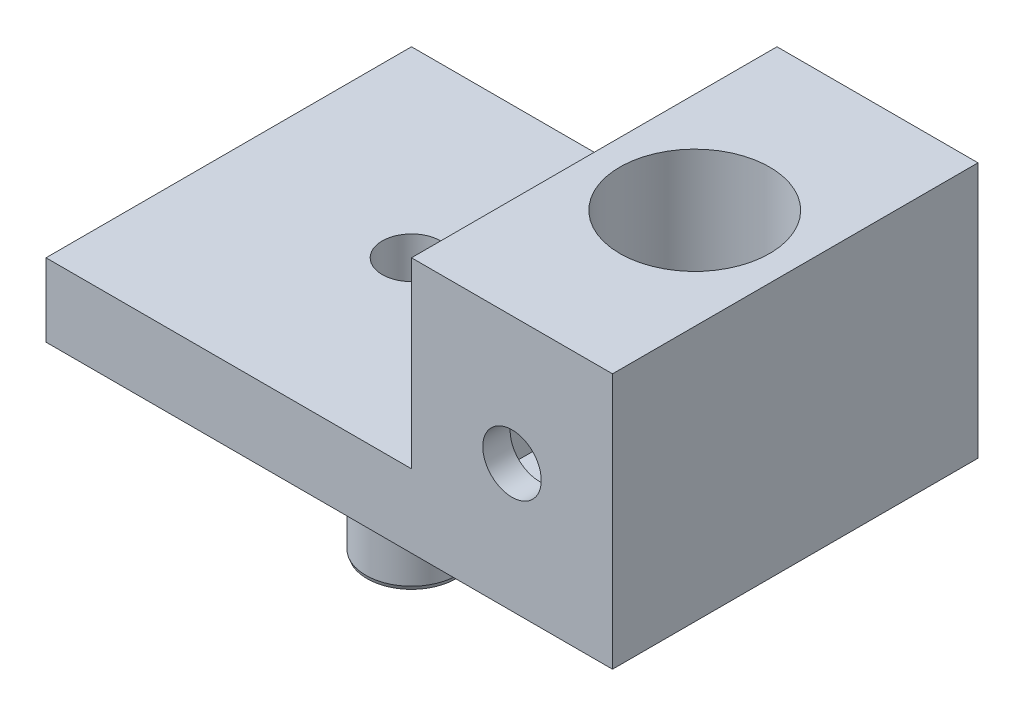
ISO-10303-21;
HEADER;
FILE_DESCRIPTION(('STEP AP214'),'2;1');
FILE_NAME('part.step','',(''),(''),'','','');
FILE_SCHEMA(('AUTOMOTIVE_DESIGN { 1 0 10303 214 1 1 1 1 }'));
ENDSEC;
DATA;
#1=APPLICATION_CONTEXT('core data for automotive mechanical design processes');
#2=APPLICATION_PROTOCOL_DEFINITION('international standard','automotive_design',2000,#1);
#3=PRODUCT_CONTEXT('',#1,'mechanical');
#4=PRODUCT('Part','Part','',(#3));
#5=PRODUCT_RELATED_PRODUCT_CATEGORY('part','',(#4));
#6=PRODUCT_DEFINITION_FORMATION('','',#4);
#7=PRODUCT_DEFINITION_CONTEXT('part definition',#1,'design');
#8=PRODUCT_DEFINITION('design','',#6,#7);
#9=PRODUCT_DEFINITION_SHAPE('','',#8);
#10=(LENGTH_UNIT() NAMED_UNIT(*) SI_UNIT(.MILLI.,.METRE.));
#11=(NAMED_UNIT(*) PLANE_ANGLE_UNIT() SI_UNIT($,.RADIAN.));
#12=(NAMED_UNIT(*) SI_UNIT($,.STERADIAN.) SOLID_ANGLE_UNIT());
#13=UNCERTAINTY_MEASURE_WITH_UNIT(LENGTH_MEASURE(1.E-05),#10,'distance_accuracy_value','');
#14=(GEOMETRIC_REPRESENTATION_CONTEXT(3) GLOBAL_UNCERTAINTY_ASSIGNED_CONTEXT((#13)) GLOBAL_UNIT_ASSIGNED_CONTEXT((#10,
#11,#12)) REPRESENTATION_CONTEXT('',''));
#15=CARTESIAN_POINT('',(0.,0.,0.));
#16=DIRECTION('',(0.,0.,1.));
#17=DIRECTION('',(1.,0.,0.));
#18=AXIS2_PLACEMENT_3D('',#15,#16,#17);
#19=CARTESIAN_POINT('',(0.,-4.,20.));
#20=DIRECTION('',(1.,0.,0.));
#21=DIRECTION('',(0.,0.,-1.));
#22=AXIS2_PLACEMENT_3D('',#19,#20,#21);
#23=PLANE('',#22);
#24=DIRECTION('',(0.,-1.,0.));
#25=VECTOR('',#24,1.);
#26=CARTESIAN_POINT('',(0.,-4.,0.));
#27=LINE('',#26,#25);
#28=CARTESIAN_POINT('',(0.,0.,0.));
#29=VERTEX_POINT('',#28);
#30=CARTESIAN_POINT('',(0.,-4.,0.));
#31=VERTEX_POINT('',#30);
#32=EDGE_CURVE('E128',#29,#31,#27,.T.);
#33=ORIENTED_EDGE('',*,*,#32,.T.);
#34=DIRECTION('',(0.,0.,-1.));
#35=VECTOR('',#34,1.);
#36=CARTESIAN_POINT('',(0.,-4.,20.));
#37=LINE('',#36,#35);
#38=CARTESIAN_POINT('',(0.,-4.,20.));
#39=VERTEX_POINT('',#38);
#40=EDGE_CURVE('E146',#39,#31,#37,.T.);
#41=ORIENTED_EDGE('',*,*,#40,.F.);
#42=DIRECTION('',(0.,-1.,0.));
#43=VECTOR('',#42,1.);
#44=CARTESIAN_POINT('',(0.,-4.,20.));
#45=LINE('',#44,#43);
#46=CARTESIAN_POINT('',(0.,0.,20.));
#47=VERTEX_POINT('',#46);
#48=EDGE_CURVE('E139',#47,#39,#45,.T.);
#49=ORIENTED_EDGE('',*,*,#48,.F.);
#50=DIRECTION('',(0.,0.,-1.));
#51=VECTOR('',#50,1.);
#52=CARTESIAN_POINT('',(0.,0.,20.));
#53=LINE('',#52,#51);
#54=EDGE_CURVE('E124',#47,#29,#53,.T.);
#55=ORIENTED_EDGE('',*,*,#54,.T.);
#56=EDGE_LOOP('',(#33,#41,#49,#55));
#57=FACE_BOUND('',#56,.T.);
#58=ADVANCED_FACE('F37',(#57),#23,.F.);
#59=CARTESIAN_POINT('',(31.,-4.,20.));
#60=DIRECTION('',(0.,1.,0.));
#61=DIRECTION('',(-1.,0.,0.));
#62=AXIS2_PLACEMENT_3D('',#59,#60,#61);
#63=PLANE('',#62);
#64=CARTESIAN_POINT('',(10.,-4.,10.));
#65=DIRECTION('',(0.,1.,0.));
#66=DIRECTION('',(-1.,0.,0.));
#67=AXIS2_PLACEMENT_3D('',#64,#65,#66);
#68=CIRCLE('',#67,2.8);
#69=CARTESIAN_POINT('',(7.2,-4.,10.));
#70=VERTEX_POINT('',#69);
#71=EDGE_CURVE('E148',#70,#70,#68,.F.);
#72=ORIENTED_EDGE('',*,*,#71,.F.);
#73=EDGE_LOOP('',(#72));
#74=FACE_BOUND('',#73,.T.);
#75=CARTESIAN_POINT('',(25.5,-4.,10.));
#76=DIRECTION('',(0.,1.,0.));
#77=DIRECTION('',(0.,0.,1.));
#78=AXIS2_PLACEMENT_3D('',#75,#76,#77);
#79=CIRCLE('',#78,4.10000000000001);
#80=CARTESIAN_POINT('',(25.5,-4.,14.1));
#81=VERTEX_POINT('',#80);
#82=EDGE_CURVE('E132',#81,#81,#79,.T.);
#83=ORIENTED_EDGE('',*,*,#82,.T.);
#84=EDGE_LOOP('',(#83));
#85=FACE_BOUND('',#84,.T.);
#86=DIRECTION('',(1.,0.,0.));
#87=VECTOR('',#86,1.);
#88=CARTESIAN_POINT('',(31.,-4.,0.));
#89=LINE('',#88,#87);
#90=CARTESIAN_POINT('',(31.,-4.,0.));
#91=VERTEX_POINT('',#90);
#92=EDGE_CURVE('E131',#31,#91,#89,.T.);
#93=ORIENTED_EDGE('',*,*,#92,.T.);
#94=DIRECTION('',(0.,0.,-1.));
#95=VECTOR('',#94,1.);
#96=CARTESIAN_POINT('',(31.,-4.,20.));
#97=LINE('',#96,#95);
#98=CARTESIAN_POINT('',(31.,-4.,20.));
#99=VERTEX_POINT('',#98);
#100=EDGE_CURVE('E143',#99,#91,#97,.T.);
#101=ORIENTED_EDGE('',*,*,#100,.F.);
#102=DIRECTION('',(1.,0.,0.));
#103=VECTOR('',#102,1.);
#104=CARTESIAN_POINT('',(31.,-4.,20.));
#105=LINE('',#104,#103);
#106=EDGE_CURVE('E94',#39,#99,#105,.T.);
#107=ORIENTED_EDGE('',*,*,#106,.F.);
#108=ORIENTED_EDGE('',*,*,#40,.T.);
#109=EDGE_LOOP('',(#93,#101,#107,#108));
#110=FACE_BOUND('',#109,.T.);
#111=ADVANCED_FACE('F201',(#74,#85,#110),#63,.F.);
#112=CARTESIAN_POINT('',(31.,10.,20.));
#113=DIRECTION('',(-1.,0.,0.));
#114=DIRECTION('',(0.,0.,1.));
#115=AXIS2_PLACEMENT_3D('',#112,#113,#114);
#116=PLANE('',#115);
#117=DIRECTION('',(0.,1.,0.));
#118=VECTOR('',#117,1.);
#119=CARTESIAN_POINT('',(31.,10.,0.));
#120=LINE('',#119,#118);
#121=CARTESIAN_POINT('',(31.,10.,0.));
#122=VERTEX_POINT('',#121);
#123=EDGE_CURVE('E134',#91,#122,#120,.T.);
#124=ORIENTED_EDGE('',*,*,#123,.T.);
#125=DIRECTION('',(0.,0.,-1.));
#126=VECTOR('',#125,1.);
#127=CARTESIAN_POINT('',(31.,10.,20.));
#128=LINE('',#127,#126);
#129=CARTESIAN_POINT('',(31.,10.,20.));
#130=VERTEX_POINT('',#129);
#131=EDGE_CURVE('E119',#130,#122,#128,.T.);
#132=ORIENTED_EDGE('',*,*,#131,.F.);
#133=DIRECTION('',(0.,1.,0.));
#134=VECTOR('',#133,1.);
#135=CARTESIAN_POINT('',(31.,10.,20.));
#136=LINE('',#135,#134);
#137=EDGE_CURVE('E110',#99,#130,#136,.T.);
#138=ORIENTED_EDGE('',*,*,#137,.F.);
#139=ORIENTED_EDGE('',*,*,#100,.T.);
#140=EDGE_LOOP('',(#124,#132,#138,#139));
#141=FACE_BOUND('',#140,.T.);
#142=ADVANCED_FACE('F206',(#141),#116,.F.);
#143=CARTESIAN_POINT('',(20.,10.,20.));
#144=DIRECTION('',(0.,-1.,0.));
#145=DIRECTION('',(0.,0.,-1.));
#146=AXIS2_PLACEMENT_3D('',#143,#144,#145);
#147=PLANE('',#146);
#148=CARTESIAN_POINT('',(25.5,10.,10.));
#149=DIRECTION('',(0.,1.,0.));
#150=DIRECTION('',(0.,0.,1.));
#151=AXIS2_PLACEMENT_3D('',#148,#149,#150);
#152=CIRCLE('',#151,4.10000000000001);
#153=CARTESIAN_POINT('',(25.5,10.,14.1));
#154=VERTEX_POINT('',#153);
#155=EDGE_CURVE('E279',#154,#154,#152,.T.);
#156=ORIENTED_EDGE('',*,*,#155,.F.);
#157=EDGE_LOOP('',(#156));
#158=FACE_BOUND('',#157,.T.);
#159=DIRECTION('',(-1.,0.,0.));
#160=VECTOR('',#159,1.);
#161=CARTESIAN_POINT('',(20.,10.,0.));
#162=LINE('',#161,#160);
#163=CARTESIAN_POINT('',(20.,10.,0.));
#164=VERTEX_POINT('',#163);
#165=EDGE_CURVE('E118',#122,#164,#162,.T.);
#166=ORIENTED_EDGE('',*,*,#165,.T.);
#167=DIRECTION('',(0.,0.,-1.));
#168=VECTOR('',#167,1.);
#169=CARTESIAN_POINT('',(20.,10.,20.));
#170=LINE('',#169,#168);
#171=CARTESIAN_POINT('',(20.,10.,20.));
#172=VERTEX_POINT('',#171);
#173=EDGE_CURVE('E115',#172,#164,#170,.T.);
#174=ORIENTED_EDGE('',*,*,#173,.F.);
#175=DIRECTION('',(-1.,0.,0.));
#176=VECTOR('',#175,1.);
#177=CARTESIAN_POINT('',(20.,10.,20.));
#178=LINE('',#177,#176);
#179=EDGE_CURVE('E104',#130,#172,#178,.T.);
#180=ORIENTED_EDGE('',*,*,#179,.F.);
#181=ORIENTED_EDGE('',*,*,#131,.T.);
#182=EDGE_LOOP('',(#166,#174,#180,#181));
#183=FACE_BOUND('',#182,.T.);
#184=ADVANCED_FACE('F116',(#158,#183),#147,.F.);
#185=CARTESIAN_POINT('',(20.,0.,20.));
#186=DIRECTION('',(1.,0.,0.));
#187=DIRECTION('',(0.,0.,-1.));
#188=AXIS2_PLACEMENT_3D('',#185,#186,#187);
#189=PLANE('',#188);
#190=DIRECTION('',(0.,-1.,0.));
#191=VECTOR('',#190,1.);
#192=CARTESIAN_POINT('',(20.,0.,0.));
#193=LINE('',#192,#191);
#194=CARTESIAN_POINT('',(20.,0.,0.));
#195=VERTEX_POINT('',#194);
#196=EDGE_CURVE('E79',#164,#195,#193,.T.);
#197=ORIENTED_EDGE('',*,*,#196,.T.);
#198=DIRECTION('',(0.,0.,-1.));
#199=VECTOR('',#198,1.);
#200=CARTESIAN_POINT('',(20.,0.,20.));
#201=LINE('',#200,#199);
#202=CARTESIAN_POINT('',(20.,0.,20.));
#203=VERTEX_POINT('',#202);
#204=EDGE_CURVE('E120',#203,#195,#201,.T.);
#205=ORIENTED_EDGE('',*,*,#204,.F.);
#206=DIRECTION('',(0.,-1.,0.));
#207=VECTOR('',#206,1.);
#208=CARTESIAN_POINT('',(20.,0.,20.));
#209=LINE('',#208,#207);
#210=EDGE_CURVE('E108',#172,#203,#209,.T.);
#211=ORIENTED_EDGE('',*,*,#210,.F.);
#212=ORIENTED_EDGE('',*,*,#173,.T.);
#213=EDGE_LOOP('',(#197,#205,#211,#212));
#214=FACE_BOUND('',#213,.T.);
#215=ADVANCED_FACE('F122',(#214),#189,.F.);
#216=CARTESIAN_POINT('',(0.,0.,20.));
#217=DIRECTION('',(0.,-1.,0.));
#218=DIRECTION('',(0.,0.,-1.));
#219=AXIS2_PLACEMENT_3D('',#216,#217,#218);
#220=PLANE('',#219);
#221=CARTESIAN_POINT('',(10.,0.,10.));
#222=DIRECTION('',(0.,-1.,0.));
#223=DIRECTION('',(0.,0.,-1.));
#224=AXIS2_PLACEMENT_3D('',#221,#222,#223);
#225=CIRCLE('',#224,1.60000000000001);
#226=CARTESIAN_POINT('',(10.,0.,8.39999999999999));
#227=VERTEX_POINT('',#226);
#228=EDGE_CURVE('E231',#227,#227,#225,.T.);
#229=ORIENTED_EDGE('',*,*,#228,.T.);
#230=EDGE_LOOP('',(#229));
#231=FACE_BOUND('',#230,.T.);
#232=DIRECTION('',(-1.,0.,0.));
#233=VECTOR('',#232,1.);
#234=CARTESIAN_POINT('',(0.,0.,0.));
#235=LINE('',#234,#233);
#236=EDGE_CURVE('E85',#195,#29,#235,.T.);
#237=ORIENTED_EDGE('',*,*,#236,.T.);
#238=ORIENTED_EDGE('',*,*,#54,.F.);
#239=DIRECTION('',(-1.,0.,0.));
#240=VECTOR('',#239,1.);
#241=CARTESIAN_POINT('',(0.,0.,20.));
#242=LINE('',#241,#240);
#243=EDGE_CURVE('E55',#203,#47,#242,.T.);
#244=ORIENTED_EDGE('',*,*,#243,.F.);
#245=ORIENTED_EDGE('',*,*,#204,.T.);
#246=EDGE_LOOP('',(#237,#238,#244,#245));
#247=FACE_BOUND('',#246,.T.);
#248=ADVANCED_FACE('F218',(#231,#247),#220,.F.);
#249=CARTESIAN_POINT('',(0.,0.,20.));
#250=DIRECTION('',(0.,0.,-1.));
#251=DIRECTION('',(-1.,0.,0.));
#252=AXIS2_PLACEMENT_3D('',#249,#250,#251);
#253=PLANE('',#252);
#254=CARTESIAN_POINT('',(25.5,3.,20.));
#255=DIRECTION('',(0.,0.,1.));
#256=DIRECTION('',(1.,0.,0.));
#257=AXIS2_PLACEMENT_3D('',#254,#255,#256);
#258=CIRCLE('',#257,1.60000000000001);
#259=CARTESIAN_POINT('',(27.1,3.,20.));
#260=VERTEX_POINT('',#259);
#261=EDGE_CURVE('E158',#260,#260,#258,.T.);
#262=ORIENTED_EDGE('',*,*,#261,.F.);
#263=EDGE_LOOP('',(#262));
#264=FACE_BOUND('',#263,.T.);
#265=ORIENTED_EDGE('',*,*,#48,.T.);
#266=ORIENTED_EDGE('',*,*,#106,.T.);
#267=ORIENTED_EDGE('',*,*,#137,.T.);
#268=ORIENTED_EDGE('',*,*,#179,.T.);
#269=ORIENTED_EDGE('',*,*,#210,.T.);
#270=ORIENTED_EDGE('',*,*,#243,.T.);
#271=EDGE_LOOP('',(#265,#266,#267,#268,#269,#270));
#272=FACE_BOUND('',#271,.T.);
#273=ADVANCED_FACE('F106',(#264,#272),#253,.F.);
#274=CARTESIAN_POINT('',(0.,0.,0.));
#275=DIRECTION('',(0.,0.,-1.));
#276=DIRECTION('',(-1.,0.,0.));
#277=AXIS2_PLACEMENT_3D('',#274,#275,#276);
#278=PLANE('',#277);
#279=ORIENTED_EDGE('',*,*,#32,.F.);
#280=ORIENTED_EDGE('',*,*,#236,.F.);
#281=ORIENTED_EDGE('',*,*,#196,.F.);
#282=ORIENTED_EDGE('',*,*,#165,.F.);
#283=ORIENTED_EDGE('',*,*,#123,.F.);
#284=ORIENTED_EDGE('',*,*,#92,.F.);
#285=EDGE_LOOP('',(#279,#280,#281,#282,#283,#284));
#286=FACE_BOUND('',#285,.T.);
#287=ADVANCED_FACE('F222',(#286),#278,.T.);
#288=CARTESIAN_POINT('',(25.5,10.,10.));
#289=DIRECTION('',(0.,1.,0.));
#290=DIRECTION('',(0.,0.,1.));
#291=AXIS2_PLACEMENT_3D('',#288,#289,#290);
#292=CYLINDRICAL_SURFACE('',#291,4.10000000000001);
#293=CARTESIAN_POINT('',(25.5,1.39999999999999,14.1));
#294=CARTESIAN_POINT('',(25.5863968574468,1.39999561626183,14.1000033732094));
#295=CARTESIAN_POINT('',(25.6727650274284,1.40701931583073,14.0972459568564));
#296=CARTESIAN_POINT('',(25.8429066370382,1.43480356175891,14.0865235130908));
#297=CARTESIAN_POINT('',(25.9266806753864,1.45556091330934,14.078559696829));
#298=CARTESIAN_POINT('',(26.089154368793,1.50995738948015,14.0582750163142));
#299=CARTESIAN_POINT('',(26.1678639300399,1.54357041433735,14.0459629837231));
#300=CARTESIAN_POINT('',(26.3185170119026,1.62258560650749,14.0181967183786));
#301=CARTESIAN_POINT('',(26.3904585626858,1.66799119167893,14.0027415749342));
#302=CARTESIAN_POINT('',(26.5288019706851,1.77145202188783,13.9694881912767));
#303=CARTESIAN_POINT('',(26.5948564123428,1.82994907205104,13.951619924981));
#304=CARTESIAN_POINT('',(26.7165026461393,1.95699437529666,13.9158840825789));
#305=CARTESIAN_POINT('',(26.7720908382111,2.02554607249595,13.8980165088159));
#306=CARTESIAN_POINT('',(26.8735283479329,2.17425603067907,13.8634720395695));
#307=CARTESIAN_POINT('',(26.9188712217394,2.25478057957376,13.8468765502277));
#308=CARTESIAN_POINT('',(26.9952144807014,2.42306038048873,13.8178546593757));
#309=CARTESIAN_POINT('',(27.0262211367272,2.51081245125897,13.8054264356978));
#310=CARTESIAN_POINT('',(27.0716143800154,2.68704554935807,13.7868996715276));
#311=CARTESIAN_POINT('',(27.0866677727601,2.77532731009322,13.780548362887));
#312=CARTESIAN_POINT('',(27.1018110923426,2.95337482007636,13.7741589458292));
#313=CARTESIAN_POINT('',(27.1019078765315,3.04313987038129,13.7741179442435));
#314=CARTESIAN_POINT('',(27.0876422466191,3.21532357563039,13.7801372630373));
#315=CARTESIAN_POINT('',(27.074228984115,3.29783754190569,13.7857970723174));
#316=CARTESIAN_POINT('',(27.0349012758559,3.45933418724486,13.8019106872001));
#317=CARTESIAN_POINT('',(27.008984784052,3.53831628603592,13.8123652774147));
#318=CARTESIAN_POINT('',(26.9449019740987,3.69235663295939,13.8371153051624));
#319=CARTESIAN_POINT('',(26.9065026956391,3.76730586379232,13.8514828681212));
#320=CARTESIAN_POINT('',(26.8187073474562,3.90996281621306,13.882418490057));
#321=CARTESIAN_POINT('',(26.7693072685968,3.97766788438357,13.8989873503855));
#322=CARTESIAN_POINT('',(26.6566556692502,4.10913371664007,13.9339380420241));
#323=CARTESIAN_POINT('',(26.592654511018,4.17224211937613,13.9523637648755));
#324=CARTESIAN_POINT('',(26.4547744335501,4.28703312289618,13.9879154944003));
#325=CARTESIAN_POINT('',(26.3808937379573,4.3387136644872,14.0050412664701));
#326=CARTESIAN_POINT('',(26.2235756937857,4.42998283180493,14.0364560781738));
#327=CARTESIAN_POINT('',(26.1399903560461,4.46933724715202,14.0506885545521));
#328=CARTESIAN_POINT('',(25.9666902640613,4.53320467840117,14.0742888622696));
#329=CARTESIAN_POINT('',(25.8769784908404,4.55772485594183,14.0836590407062));
#330=CARTESIAN_POINT('',(25.699449226159,4.58993438587925,14.0960571997284));
#331=CARTESIAN_POINT('',(25.6118138727216,4.59850113134782,14.0994153784156));
#332=CARTESIAN_POINT('',(25.4363026148072,4.60113709911149,14.1004434500538));
#333=CARTESIAN_POINT('',(25.3484267742528,4.59520985883634,14.09811473096));
#334=CARTESIAN_POINT('',(25.178832035732,4.56968018793518,14.0882476043303));
#335=CARTESIAN_POINT('',(25.0970099546501,4.55066704728577,14.0809338187501));
#336=CARTESIAN_POINT('',(24.9377856005721,4.5002967972366,14.0620619679242));
#337=CARTESIAN_POINT('',(24.8603839006473,4.46893809146186,14.050503353803));
#338=CARTESIAN_POINT('',(24.7095731450664,4.3937500751827,14.023837647486));
#339=CARTESIAN_POINT('',(24.6363551140856,4.34957293176445,14.0086339813993));
#340=CARTESIAN_POINT('',(24.4981183071721,4.25039064268326,13.976340069313));
#341=CARTESIAN_POINT('',(24.4331027391242,4.19538128207519,13.9592490900779));
#342=CARTESIAN_POINT('',(24.308833289801,4.07203472263344,13.9237175430147));
#343=CARTESIAN_POINT('',(24.2501986063237,4.00307704493544,13.9052596797031));
#344=CARTESIAN_POINT('',(24.145192955169,3.85595896387968,13.8700869290105));
#345=CARTESIAN_POINT('',(24.0988236176642,3.77779733922929,13.853372273496));
#346=CARTESIAN_POINT('',(24.0194762546428,3.61353466415413,13.8235935730478));
#347=CARTESIAN_POINT('',(23.9865991214465,3.52737950016373,13.8105572523242));
#348=CARTESIAN_POINT('',(23.9360588978006,3.350097765047,13.7900983978946));
#349=CARTESIAN_POINT('',(23.9183853102714,3.25897467025826,13.7826719913327));
#350=CARTESIAN_POINT('',(23.8997316526638,3.08111441495103,13.774815766734));
#351=CARTESIAN_POINT('',(23.8976844378118,2.99450813818162,13.7739387774821));
#352=CARTESIAN_POINT('',(23.9075663051918,2.82225107636631,13.7781190338024));
#353=CARTESIAN_POINT('',(23.9194938178172,2.73660018510459,13.7831756129312));
#354=CARTESIAN_POINT('',(23.9561305956029,2.57181744066768,13.7982674207229));
#355=CARTESIAN_POINT('',(23.9803667707116,2.49256197342245,13.8081178482089));
#356=CARTESIAN_POINT('',(24.0405006549904,2.33920469926605,13.8315659871662));
#357=CARTESIAN_POINT('',(24.0764014200508,2.26510424904978,13.8451646804668));
#358=CARTESIAN_POINT('',(24.1611486089141,2.11968963378917,13.8755137449173));
#359=CARTESIAN_POINT('',(24.2106022104107,2.04875746774236,13.8923970142566));
#360=CARTESIAN_POINT('',(24.3201434397243,1.91585977734069,13.9269880609251));
#361=CARTESIAN_POINT('',(24.3802345849292,1.85389723121813,13.9446961095425));
#362=CARTESIAN_POINT('',(24.5136848919897,1.73685986668224,13.9802291308595));
#363=CARTESIAN_POINT('',(24.587627001354,1.6824289888419,13.9979963003666));
#364=CARTESIAN_POINT('',(24.744237857681,1.5867606640353,14.0305356420814));
#365=CARTESIAN_POINT('',(24.8269085465105,1.54552616115641,14.0453071456928));
#366=CARTESIAN_POINT('',(25.0055337953523,1.47506787495903,14.0711484941185));
#367=CARTESIAN_POINT('',(25.1020216851937,1.44704003719985,14.0818370565342));
#368=CARTESIAN_POINT('',(25.299020999413,1.40951437674147,14.0962586980466));
#369=CARTESIAN_POINT('',(25.3995298969485,1.40000509780837,14.0999960773262));
#370=CARTESIAN_POINT('',(25.5,1.39999999999999,14.1));
#371=B_SPLINE_CURVE_WITH_KNOTS('',3,(#293,#294,#295,#296,#297,#298,#299,#300,#301,#302,#303,
#304,#305,#306,#307,#308,#309,#310,#311,#312,#313,#314,#315,#316,#317,#318,#319,#320,#321,#322,
#323,#324,#325,#326,#327,#328,#329,#330,#331,#332,#333,#334,#335,#336,#337,#338,#339,#340,#341,
#342,#343,#344,#345,#346,#347,#348,#349,#350,#351,#352,#353,#354,#355,#356,#357,#358,#359,#360,
#361,#362,#363,#364,#365,#366,#367,#368,#369,#370),.UNSPECIFIED.,.T.,.F.,(4,2,2,2,2,2,2,2,2,2,2,
2,2,2,2,2,2,2,2,2,2,2,2,2,2,2,2,2,2,2,2,2,2,2,2,2,2,2,4),(0.,0.258819708022163,
0.517579228928646,0.775816177676655,1.03412805538057,1.30301613547218,1.57199653647336,
1.85226204394676,2.13240484295993,2.40031100869253,2.66809434363401,2.91829172726609,
3.16853006750121,3.42373592732407,3.67903494712591,3.95303766408765,4.22708971359854,
4.50607099532343,4.78491748341417,5.04791536154831,5.31084905832677,5.56265650759195,
5.81449652816571,6.07393785644217,6.33348033663669,6.60933983572729,6.88523598057692,
7.16315920121917,7.44089037921966,7.6994690938064,7.95801876826001,8.20730825870165,
8.45666311075812,8.71983704321145,8.98309815930312,9.26229452610702,9.54155313776352,
9.84271854305264,10.1436975775361),.UNSPECIFIED.);
#372=CARTESIAN_POINT('',(25.5,1.39999999999999,14.1));
#373=VERTEX_POINT('',#372);
#374=EDGE_CURVE('E149',#373,#373,#371,.T.);
#375=ORIENTED_EDGE('',*,*,#374,.T.);
#376=EDGE_LOOP('',(#375));
#377=FACE_BOUND('',#376,.T.);
#378=ORIENTED_EDGE('',*,*,#82,.F.);
#379=EDGE_LOOP('',(#378));
#380=FACE_BOUND('',#379,.T.);
#381=ORIENTED_EDGE('',*,*,#155,.T.);
#382=EDGE_LOOP('',(#381));
#383=FACE_BOUND('',#382,.T.);
#384=ADVANCED_FACE('F159',(#377,#380,#383),#292,.F.);
#385=CARTESIAN_POINT('',(25.5,3.,20.));
#386=DIRECTION('',(0.,0.,1.));
#387=DIRECTION('',(1.,0.,0.));
#388=AXIS2_PLACEMENT_3D('',#385,#386,#387);
#389=CYLINDRICAL_SURFACE('',#388,1.60000000000001);
#390=CARTESIAN_POINT('',(25.5,3.,15.5));
#391=DIRECTION('',(0.,0.,1.));
#392=DIRECTION('',(1.,0.,0.));
#393=AXIS2_PLACEMENT_3D('',#390,#391,#392);
#394=CIRCLE('',#393,1.60000000000001);
#395=CARTESIAN_POINT('',(27.1,3.,15.5));
#396=VERTEX_POINT('',#395);
#397=EDGE_CURVE('E157',#396,#396,#394,.T.);
#398=ORIENTED_EDGE('',*,*,#397,.T.);
#399=EDGE_LOOP('',(#398));
#400=FACE_BOUND('',#399,.T.);
#401=ORIENTED_EDGE('',*,*,#374,.F.);
#402=EDGE_LOOP('',(#401));
#403=FACE_BOUND('',#402,.T.);
#404=ADVANCED_FACE('F171',(#400,#403),#389,.F.);
#405=CARTESIAN_POINT('',(22.5,6.00000000000001,15.5));
#406=DIRECTION('',(0.,-1.,0.));
#407=DIRECTION('',(0.,0.,-1.));
#408=AXIS2_PLACEMENT_3D('',#405,#406,#407);
#409=PLANE('',#408);
#410=DIRECTION('',(1.,0.,0.));
#411=VECTOR('',#410,1.);
#412=CARTESIAN_POINT('',(22.5,6.00000000000001,18.5));
#413=LINE('',#412,#411);
#414=CARTESIAN_POINT('',(22.5,6.00000000000001,18.5));
#415=VERTEX_POINT('',#414);
#416=CARTESIAN_POINT('',(28.5,6.00000000000001,18.5));
#417=VERTEX_POINT('',#416);
#418=EDGE_CURVE('E243',#415,#417,#413,.T.);
#419=ORIENTED_EDGE('',*,*,#418,.F.);
#420=DIRECTION('',(0.,0.,1.));
#421=VECTOR('',#420,1.);
#422=CARTESIAN_POINT('',(22.5,6.00000000000001,15.5));
#423=LINE('',#422,#421);
#424=CARTESIAN_POINT('',(22.5,6.00000000000001,15.5));
#425=VERTEX_POINT('',#424);
#426=EDGE_CURVE('E257',#425,#415,#423,.T.);
#427=ORIENTED_EDGE('',*,*,#426,.F.);
#428=DIRECTION('',(1.,0.,0.));
#429=VECTOR('',#428,1.);
#430=CARTESIAN_POINT('',(22.5,6.00000000000001,15.5));
#431=LINE('',#430,#429);
#432=CARTESIAN_POINT('',(28.5,6.00000000000001,15.5));
#433=VERTEX_POINT('',#432);
#434=EDGE_CURVE('E244',#425,#433,#431,.T.);
#435=ORIENTED_EDGE('',*,*,#434,.T.);
#436=DIRECTION('',(0.,0.,1.));
#437=VECTOR('',#436,1.);
#438=CARTESIAN_POINT('',(28.5,6.00000000000001,15.5));
#439=LINE('',#438,#437);
#440=EDGE_CURVE('E276',#433,#417,#439,.T.);
#441=ORIENTED_EDGE('',*,*,#440,.T.);
#442=EDGE_LOOP('',(#419,#427,#435,#441));
#443=FACE_BOUND('',#442,.T.);
#444=ADVANCED_FACE('F191',(#443),#409,.T.);
#445=CARTESIAN_POINT('',(28.5,0.,15.5));
#446=DIRECTION('',(1.,0.,0.));
#447=DIRECTION('',(0.,0.,-1.));
#448=AXIS2_PLACEMENT_3D('',#445,#446,#447);
#449=PLANE('',#448);
#450=DIRECTION('',(0.,1.,0.));
#451=VECTOR('',#450,1.);
#452=CARTESIAN_POINT('',(28.5,0.,18.5));
#453=LINE('',#452,#451);
#454=CARTESIAN_POINT('',(28.5,0.,18.5));
#455=VERTEX_POINT('',#454);
#456=EDGE_CURVE('E260',#455,#417,#453,.T.);
#457=ORIENTED_EDGE('',*,*,#456,.T.);
#458=ORIENTED_EDGE('',*,*,#440,.F.);
#459=DIRECTION('',(0.,1.,0.));
#460=VECTOR('',#459,1.);
#461=CARTESIAN_POINT('',(28.5,0.,15.5));
#462=LINE('',#461,#460);
#463=CARTESIAN_POINT('',(28.5,0.,15.5));
#464=VERTEX_POINT('',#463);
#465=EDGE_CURVE('E247',#464,#433,#462,.T.);
#466=ORIENTED_EDGE('',*,*,#465,.F.);
#467=DIRECTION('',(0.,0.,1.));
#468=VECTOR('',#467,1.);
#469=CARTESIAN_POINT('',(28.5,0.,15.5));
#470=LINE('',#469,#468);
#471=EDGE_CURVE('E273',#464,#455,#470,.T.);
#472=ORIENTED_EDGE('',*,*,#471,.T.);
#473=EDGE_LOOP('',(#457,#458,#466,#472));
#474=FACE_BOUND('',#473,.T.);
#475=ADVANCED_FACE('F188',(#474),#449,.F.);
#476=CARTESIAN_POINT('',(22.5,0.,15.5));
#477=DIRECTION('',(0.,-1.,0.));
#478=DIRECTION('',(0.,0.,-1.));
#479=AXIS2_PLACEMENT_3D('',#476,#477,#478);
#480=PLANE('',#479);
#481=DIRECTION('',(1.,0.,0.));
#482=VECTOR('',#481,1.);
#483=CARTESIAN_POINT('',(22.5,0.,18.5));
#484=LINE('',#483,#482);
#485=CARTESIAN_POINT('',(22.5,0.,18.5));
#486=VERTEX_POINT('',#485);
#487=EDGE_CURVE('E263',#486,#455,#484,.T.);
#488=ORIENTED_EDGE('',*,*,#487,.T.);
#489=ORIENTED_EDGE('',*,*,#471,.F.);
#490=DIRECTION('',(1.,0.,0.));
#491=VECTOR('',#490,1.);
#492=CARTESIAN_POINT('',(22.5,0.,15.5));
#493=LINE('',#492,#491);
#494=CARTESIAN_POINT('',(22.5,0.,15.5));
#495=VERTEX_POINT('',#494);
#496=EDGE_CURVE('E251',#495,#464,#493,.T.);
#497=ORIENTED_EDGE('',*,*,#496,.F.);
#498=DIRECTION('',(0.,0.,1.));
#499=VECTOR('',#498,1.);
#500=CARTESIAN_POINT('',(22.5,0.,15.5));
#501=LINE('',#500,#499);
#502=EDGE_CURVE('E270',#495,#486,#501,.T.);
#503=ORIENTED_EDGE('',*,*,#502,.T.);
#504=EDGE_LOOP('',(#488,#489,#497,#503));
#505=FACE_BOUND('',#504,.T.);
#506=ADVANCED_FACE('F184',(#505),#480,.F.);
#507=CARTESIAN_POINT('',(22.5,0.,15.5));
#508=DIRECTION('',(1.,0.,0.));
#509=DIRECTION('',(0.,0.,-1.));
#510=AXIS2_PLACEMENT_3D('',#507,#508,#509);
#511=PLANE('',#510);
#512=DIRECTION('',(0.,1.,0.));
#513=VECTOR('',#512,1.);
#514=CARTESIAN_POINT('',(22.5,0.,18.5));
#515=LINE('',#514,#513);
#516=EDGE_CURVE('E248',#486,#415,#515,.T.);
#517=ORIENTED_EDGE('',*,*,#516,.F.);
#518=ORIENTED_EDGE('',*,*,#502,.F.);
#519=DIRECTION('',(0.,1.,0.));
#520=VECTOR('',#519,1.);
#521=CARTESIAN_POINT('',(22.5,0.,15.5));
#522=LINE('',#521,#520);
#523=EDGE_CURVE('E254',#495,#425,#522,.T.);
#524=ORIENTED_EDGE('',*,*,#523,.T.);
#525=ORIENTED_EDGE('',*,*,#426,.T.);
#526=EDGE_LOOP('',(#517,#518,#524,#525));
#527=FACE_BOUND('',#526,.T.);
#528=ADVANCED_FACE('F177',(#527),#511,.T.);
#529=CARTESIAN_POINT('',(0.,0.,15.5));
#530=DIRECTION('',(0.,0.,1.));
#531=DIRECTION('',(1.,0.,0.));
#532=AXIS2_PLACEMENT_3D('',#529,#530,#531);
#533=PLANE('',#532);
#534=ORIENTED_EDGE('',*,*,#397,.F.);
#535=EDGE_LOOP('',(#534));
#536=FACE_BOUND('',#535,.T.);
#537=ORIENTED_EDGE('',*,*,#434,.F.);
#538=ORIENTED_EDGE('',*,*,#523,.F.);
#539=ORIENTED_EDGE('',*,*,#496,.T.);
#540=ORIENTED_EDGE('',*,*,#465,.T.);
#541=EDGE_LOOP('',(#537,#538,#539,#540));
#542=FACE_BOUND('',#541,.T.);
#543=ADVANCED_FACE('F174',(#536,#542),#533,.T.);
#544=CARTESIAN_POINT('',(0.,0.,18.5));
#545=DIRECTION('',(0.,0.,1.));
#546=DIRECTION('',(1.,0.,0.));
#547=AXIS2_PLACEMENT_3D('',#544,#545,#546);
#548=PLANE('',#547);
#549=CARTESIAN_POINT('',(25.5,3.,18.5));
#550=DIRECTION('',(0.,0.,1.));
#551=DIRECTION('',(1.,0.,0.));
#552=AXIS2_PLACEMENT_3D('',#549,#550,#551);
#553=CIRCLE('',#552,1.60000000000001);
#554=CARTESIAN_POINT('',(27.1,3.,18.5));
#555=VERTEX_POINT('',#554);
#556=EDGE_CURVE('E240',#555,#555,#553,.T.);
#557=ORIENTED_EDGE('',*,*,#556,.T.);
#558=EDGE_LOOP('',(#557));
#559=FACE_BOUND('',#558,.T.);
#560=ORIENTED_EDGE('',*,*,#418,.T.);
#561=ORIENTED_EDGE('',*,*,#456,.F.);
#562=ORIENTED_EDGE('',*,*,#487,.F.);
#563=ORIENTED_EDGE('',*,*,#516,.T.);
#564=EDGE_LOOP('',(#560,#561,#562,#563));
#565=FACE_BOUND('',#564,.T.);
#566=ADVANCED_FACE('F169',(#559,#565),#548,.F.);
#567=ORIENTED_EDGE('',*,*,#261,.T.);
#568=EDGE_LOOP('',(#567));
#569=FACE_BOUND('',#568,.T.);
#570=ORIENTED_EDGE('',*,*,#556,.F.);
#571=EDGE_LOOP('',(#570));
#572=FACE_BOUND('',#571,.T.);
#573=ADVANCED_FACE('F163',(#569,#572),#389,.F.);
#574=CARTESIAN_POINT('',(10.,-4.6,10.));
#575=DIRECTION('',(0.,-1.,0.));
#576=DIRECTION('',(1.,0.,0.));
#577=AXIS2_PLACEMENT_3D('',#574,#575,#576);
#578=PLANE('',#577);
#579=CARTESIAN_POINT('',(10.,-4.6,10.));
#580=DIRECTION('',(0.,-1.,0.));
#581=DIRECTION('',(1.,0.,0.));
#582=AXIS2_PLACEMENT_3D('',#579,#580,#581);
#583=CIRCLE('',#582,2.8);
#584=CARTESIAN_POINT('',(12.8,-4.6,10.));
#585=VERTEX_POINT('',#584);
#586=EDGE_CURVE('E409',#585,#585,#583,.T.);
#587=ORIENTED_EDGE('',*,*,#586,.T.);
#588=EDGE_LOOP('',(#587));
#589=FACE_BOUND('',#588,.T.);
#590=CARTESIAN_POINT('',(10.,-4.6,10.));
#591=DIRECTION('',(0.,-1.,0.));
#592=DIRECTION('',(1.,0.,0.));
#593=AXIS2_PLACEMENT_3D('',#590,#591,#592);
#594=CIRCLE('',#593,2.5);
#595=CARTESIAN_POINT('',(12.5,-4.6,10.));
#596=VERTEX_POINT('',#595);
#597=EDGE_CURVE('E407',#596,#596,#594,.T.);
#598=ORIENTED_EDGE('',*,*,#597,.F.);
#599=EDGE_LOOP('',(#598));
#600=FACE_BOUND('',#599,.T.);
#601=ADVANCED_FACE('F168',(#589,#600),#578,.T.);
#602=CARTESIAN_POINT('',(10.,-4.6,10.));
#603=DIRECTION('',(0.,1.,0.));
#604=DIRECTION('',(-1.,0.,0.));
#605=AXIS2_PLACEMENT_3D('',#602,#603,#604);
#606=CYLINDRICAL_SURFACE('',#605,2.8);
#607=ORIENTED_EDGE('',*,*,#586,.F.);
#608=EDGE_LOOP('',(#607));
#609=FACE_BOUND('',#608,.T.);
#610=ORIENTED_EDGE('',*,*,#71,.T.);
#611=EDGE_LOOP('',(#610));
#612=FACE_BOUND('',#611,.T.);
#613=ADVANCED_FACE('F351',(#609,#612),#606,.T.);
#614=CARTESIAN_POINT('',(10.,-14.,10.));
#615=DIRECTION('',(0.,1.,0.));
#616=DIRECTION('',(-1.,0.,0.));
#617=AXIS2_PLACEMENT_3D('',#614,#615,#616);
#618=CYLINDRICAL_SURFACE('',#617,2.5);
#619=CARTESIAN_POINT('',(10.,-13.8,10.));
#620=DIRECTION('',(0.,-1.,0.));
#621=DIRECTION('',(0.,0.,-1.));
#622=AXIS2_PLACEMENT_3D('',#619,#620,#621);
#623=CIRCLE('',#622,2.5);
#624=CARTESIAN_POINT('',(10.,-13.8,7.5));
#625=VERTEX_POINT('',#624);
#626=EDGE_CURVE('E11',#625,#625,#623,.F.);
#627=ORIENTED_EDGE('',*,*,#626,.T.);
#628=EDGE_LOOP('',(#627));
#629=FACE_BOUND('',#628,.T.);
#630=ORIENTED_EDGE('',*,*,#597,.T.);
#631=EDGE_LOOP('',(#630));
#632=FACE_BOUND('',#631,.T.);
#633=ADVANCED_FACE('F172',(#629,#632),#618,.T.);
#634=CARTESIAN_POINT('',(10.,-14.,10.));
#635=DIRECTION('',(0.,-1.,0.));
#636=DIRECTION('',(1.,0.,0.));
#637=AXIS2_PLACEMENT_3D('',#634,#635,#636);
#638=PLANE('',#637);
#639=CARTESIAN_POINT('',(10.,-14.,10.));
#640=DIRECTION('',(0.,-1.,0.));
#641=DIRECTION('',(1.,0.,0.));
#642=AXIS2_PLACEMENT_3D('',#639,#640,#641);
#643=CIRCLE('',#642,2.42720595314676);
#644=CARTESIAN_POINT('',(12.4272059531468,-14.,10.));
#645=VERTEX_POINT('',#644);
#646=EDGE_CURVE('E47',#645,#645,#643,.T.);
#647=ORIENTED_EDGE('',*,*,#646,.T.);
#648=EDGE_LOOP('',(#647));
#649=FACE_BOUND('',#648,.T.);
#650=CARTESIAN_POINT('',(10.,-14.,10.));
#651=DIRECTION('',(0.,-1.,0.));
#652=DIRECTION('',(0.,0.,-1.));
#653=AXIS2_PLACEMENT_3D('',#650,#651,#652);
#654=CIRCLE('',#653,1.60000000000001);
#655=CARTESIAN_POINT('',(10.,-14.,8.39999999999999));
#656=VERTEX_POINT('',#655);
#657=EDGE_CURVE('E234',#656,#656,#654,.T.);
#658=ORIENTED_EDGE('',*,*,#657,.F.);
#659=EDGE_LOOP('',(#658));
#660=FACE_BOUND('',#659,.T.);
#661=ADVANCED_FACE('F371',(#649,#660),#638,.T.);
#662=CARTESIAN_POINT('',(10.,-14.,10.));
#663=DIRECTION('',(0.,-1.,0.));
#664=DIRECTION('',(0.,0.,-1.));
#665=AXIS2_PLACEMENT_3D('',#662,#663,#664);
#666=CYLINDRICAL_SURFACE('',#665,1.60000000000001);
#667=ORIENTED_EDGE('',*,*,#657,.T.);
#668=EDGE_LOOP('',(#667));
#669=FACE_BOUND('',#668,.T.);
#670=ORIENTED_EDGE('',*,*,#228,.F.);
#671=EDGE_LOOP('',(#670));
#672=FACE_BOUND('',#671,.T.);
#673=ADVANCED_FACE('F380',(#669,#672),#666,.F.);
#674=CARTESIAN_POINT('',(10.,-14.,10.));
#675=DIRECTION('',(0.,1.,0.));
#676=DIRECTION('',(0.,0.,1.));
#677=AXIS2_PLACEMENT_3D('',#674,#675,#676);
#678=CONICAL_SURFACE('',#677,2.42720595314676,0.349065850398868);
#679=ORIENTED_EDGE('',*,*,#626,.F.);
#680=EDGE_LOOP('',(#679));
#681=FACE_BOUND('',#680,.T.);
#682=ORIENTED_EDGE('',*,*,#646,.F.);
#683=EDGE_LOOP('',(#682));
#684=FACE_BOUND('',#683,.T.);
#685=ADVANCED_FACE('F40',(#681,#684),#678,.T.);
#686=CLOSED_SHELL('',(#58,#111,#142,#184,#215,#248,#273,#287,#384,#404,#444,#475,#506,#528,#543,
#566,#573,#601,#613,#633,#661,#673,#685));
#687=MANIFOLD_SOLID_BREP('B2',#686);
#688=ADVANCED_BREP_SHAPE_REPRESENTATION('',(#18,#687),#14);
#689=SHAPE_DEFINITION_REPRESENTATION(#9,#688);
ENDSEC;
END-ISO-10303-21;
